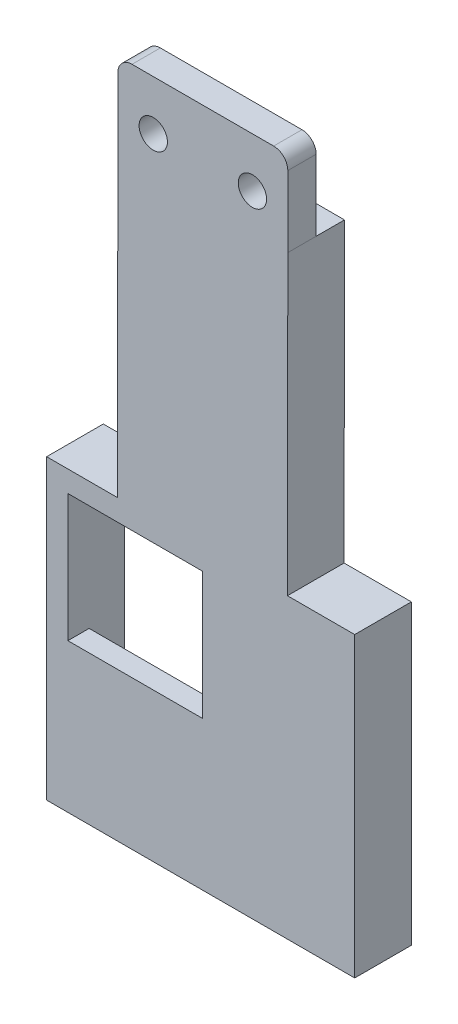
ISO-10303-21;
HEADER;
FILE_DESCRIPTION(('STEP AP214'),'2;1');
FILE_NAME('part.step','',(''),(''),'','','');
FILE_SCHEMA(('AUTOMOTIVE_DESIGN { 1 0 10303 214 1 1 1 1 }'));
ENDSEC;
DATA;
#1=APPLICATION_CONTEXT('core data for automotive mechanical design processes');
#2=APPLICATION_PROTOCOL_DEFINITION('international standard','automotive_design',2000,#1);
#3=PRODUCT_CONTEXT('',#1,'mechanical');
#4=PRODUCT('Part','Part','',(#3));
#5=PRODUCT_RELATED_PRODUCT_CATEGORY('part','',(#4));
#6=PRODUCT_DEFINITION_FORMATION('','',#4);
#7=PRODUCT_DEFINITION_CONTEXT('part definition',#1,'design');
#8=PRODUCT_DEFINITION('design','',#6,#7);
#9=PRODUCT_DEFINITION_SHAPE('','',#8);
#10=(LENGTH_UNIT() NAMED_UNIT(*) SI_UNIT(.MILLI.,.METRE.));
#11=(NAMED_UNIT(*) PLANE_ANGLE_UNIT() SI_UNIT($,.RADIAN.));
#12=(NAMED_UNIT(*) SI_UNIT($,.STERADIAN.) SOLID_ANGLE_UNIT());
#13=UNCERTAINTY_MEASURE_WITH_UNIT(LENGTH_MEASURE(1.E-05),#10,'distance_accuracy_value','');
#14=(GEOMETRIC_REPRESENTATION_CONTEXT(3) GLOBAL_UNCERTAINTY_ASSIGNED_CONTEXT((#13)) GLOBAL_UNIT_ASSIGNED_CONTEXT((#10,
#11,#12)) REPRESENTATION_CONTEXT('',''));
#15=CARTESIAN_POINT('',(0.,0.,0.));
#16=DIRECTION('',(0.,0.,1.));
#17=DIRECTION('',(1.,0.,0.));
#18=AXIS2_PLACEMENT_3D('',#15,#16,#17);
#19=CARTESIAN_POINT('',(-0.0848383427768669,-68.968459670805,0.));
#20=DIRECTION('',(0.00123010255695314,0.999999243423563,0.));
#21=DIRECTION('',(-0.999999243423563,0.00123010255695314,0.));
#22=AXIS2_PLACEMENT_3D('',#19,#20,#21);
#23=PLANE('',#22);
#24=DIRECTION('',(0.999999243423563,-0.00123010255695314,0.));
#25=VECTOR('',#24,1.);
#26=CARTESIAN_POINT('',(-0.0848383427768669,-68.968459670805,1.));
#27=LINE('',#26,#25);
#28=CARTESIAN_POINT('',(37.5278711344987,-69.0147271959118,1.));
#29=VERTEX_POINT('',#28);
#30=CARTESIAN_POINT('',(49.5278711344987,-69.0294884377633,1.));
#31=VERTEX_POINT('',#30);
#32=EDGE_CURVE('E248',#29,#31,#27,.T.);
#33=ORIENTED_EDGE('',*,*,#32,.F.);
#34=DIRECTION('',(0.,0.,1.));
#35=VECTOR('',#34,1.);
#36=CARTESIAN_POINT('',(37.5278711344971,-69.0147271959118,0.));
#37=LINE('',#36,#35);
#38=CARTESIAN_POINT('',(37.5278711344971,-69.0147271959118,-4.));
#39=VERTEX_POINT('',#38);
#40=EDGE_CURVE('E49',#39,#29,#37,.T.);
#41=ORIENTED_EDGE('',*,*,#40,.F.);
#42=DIRECTION('',(0.999999243423563,-0.00123010255695314,0.));
#43=VECTOR('',#42,1.);
#44=CARTESIAN_POINT('',(25.5278711344987,-68.9999659540604,-4.));
#45=LINE('',#44,#43);
#46=CARTESIAN_POINT('',(49.5278711344987,-69.0294884377633,-4.));
#47=VERTEX_POINT('',#46);
#48=EDGE_CURVE('E305',#39,#47,#45,.T.);
#49=ORIENTED_EDGE('',*,*,#48,.T.);
#50=DIRECTION('',(0.,0.,1.));
#51=VECTOR('',#50,1.);
#52=CARTESIAN_POINT('',(49.5278711344987,-69.0294884377633,4.));
#53=LINE('',#52,#51);
#54=EDGE_CURVE('E307',#47,#31,#53,.T.);
#55=ORIENTED_EDGE('',*,*,#54,.T.);
#56=EDGE_LOOP('',(#33,#41,#49,#55));
#57=FACE_BOUND('',#56,.T.);
#58=ADVANCED_FACE('F41',(#57),#23,.F.);
#59=CARTESIAN_POINT('',(25.5278711344987,-68.9999659540604,4.));
#60=DIRECTION('',(0.999999243423563,-0.00123010255695312,0.));
#61=DIRECTION('',(0.00123010255695312,0.999999243423564,0.));
#62=AXIS2_PLACEMENT_3D('',#59,#60,#61);
#63=PLANE('',#62);
#64=DIRECTION('',(0.,0.,1.));
#65=VECTOR('',#64,1.);
#66=CARTESIAN_POINT('',(25.5315432871065,-66.0147271959118,4.));
#67=LINE('',#66,#65);
#68=CARTESIAN_POINT('',(25.5315432871065,-66.0147271959118,-4.));
#69=VERTEX_POINT('',#68);
#70=CARTESIAN_POINT('',(25.5315432871065,-66.0147271959118,4.));
#71=VERTEX_POINT('',#70);
#72=EDGE_CURVE('E64',#69,#71,#67,.T.);
#73=ORIENTED_EDGE('',*,*,#72,.T.);
#74=DIRECTION('',(0.00123010255695312,0.999999243423563,0.));
#75=VECTOR('',#74,1.);
#76=CARTESIAN_POINT('',(25.5278711344987,-68.9999659540604,4.));
#77=LINE('',#76,#75);
#78=CARTESIAN_POINT('',(25.5832257495616,-24.,4.));
#79=VERTEX_POINT('',#78);
#80=EDGE_CURVE('E325',#71,#79,#77,.T.);
#81=ORIENTED_EDGE('',*,*,#80,.T.);
#82=DIRECTION('',(0.,0.,-1.));
#83=VECTOR('',#82,1.);
#84=CARTESIAN_POINT('',(25.5832257495616,-24.,4.));
#85=LINE('',#84,#83);
#86=CARTESIAN_POINT('',(25.5832257495616,-24.,0.));
#87=VERTEX_POINT('',#86);
#88=EDGE_CURVE('E374',#79,#87,#85,.T.);
#89=ORIENTED_EDGE('',*,*,#88,.T.);
#90=DIRECTION('',(0.,0.,-1.));
#91=VECTOR('',#90,1.);
#92=CARTESIAN_POINT('',(25.5832257495616,-24.,4.));
#93=LINE('',#92,#91);
#94=CARTESIAN_POINT('',(25.5832257495616,-24.,-4.));
#95=VERTEX_POINT('',#94);
#96=EDGE_CURVE('E304',#87,#95,#93,.T.);
#97=ORIENTED_EDGE('',*,*,#96,.T.);
#98=DIRECTION('',(0.00123010255695312,0.999999243423563,0.));
#99=VECTOR('',#98,1.);
#100=CARTESIAN_POINT('',(25.5278711344987,-68.9999659540604,-4.));
#101=LINE('',#100,#99);
#102=EDGE_CURVE('E323',#69,#95,#101,.T.);
#103=ORIENTED_EDGE('',*,*,#102,.F.);
#104=EDGE_LOOP('',(#73,#81,#89,#97,#103));
#105=FACE_BOUND('',#104,.T.);
#106=ADVANCED_FACE('F424',(#105),#63,.F.);
#107=CARTESIAN_POINT('',(49.5278711344987,-69.0294884377633,4.));
#108=DIRECTION('',(-0.999999243423563,0.00123010255695312,0.));
#109=DIRECTION('',(-0.00123010255695312,-0.999999243423564,0.));
#110=AXIS2_PLACEMENT_3D('',#107,#108,#109);
#111=PLANE('',#110);
#112=DIRECTION('',(0.00123010255695312,0.999999243423564,0.));
#113=VECTOR('',#112,1.);
#114=CARTESIAN_POINT('',(49.5278711344987,-69.0294884377633,1.));
#115=LINE('',#114,#113);
#116=CARTESIAN_POINT('',(49.5278892923538,-69.0147271959118,1.));
#117=VERTEX_POINT('',#116);
#118=EDGE_CURVE('E246',#31,#117,#115,.T.);
#119=ORIENTED_EDGE('',*,*,#118,.F.);
#120=ORIENTED_EDGE('',*,*,#54,.F.);
#121=DIRECTION('',(0.00123010255695312,0.999999243423563,0.));
#122=VECTOR('',#121,1.);
#123=CARTESIAN_POINT('',(49.5278711344987,-69.0294884377633,-4.));
#124=LINE('',#123,#122);
#125=CARTESIAN_POINT('',(49.5278892923538,-69.0147271959118,-4.));
#126=VERTEX_POINT('',#125);
#127=EDGE_CURVE('E321',#47,#126,#124,.T.);
#128=ORIENTED_EDGE('',*,*,#127,.T.);
#129=DIRECTION('',(0.,0.,-1.));
#130=VECTOR('',#129,1.);
#131=CARTESIAN_POINT('',(49.5278892923538,-69.0147271959118,4.));
#132=LINE('',#131,#130);
#133=EDGE_CURVE('E295',#117,#126,#132,.T.);
#134=ORIENTED_EDGE('',*,*,#133,.F.);
#135=EDGE_LOOP('',(#119,#120,#128,#134));
#136=FACE_BOUND('',#135,.T.);
#137=ADVANCED_FACE('F394',(#136),#111,.F.);
#138=DIRECTION('',(0.00123010255695312,0.999999243423563,0.));
#139=VECTOR('',#138,1.);
#140=CARTESIAN_POINT('',(49.5278711344987,-69.0294884377633,4.));
#141=LINE('',#140,#139);
#142=CARTESIAN_POINT('',(49.5315796028167,-66.0147271959118,4.));
#143=VERTEX_POINT('',#142);
#144=CARTESIAN_POINT('',(49.5832257495616,-24.0295224837029,4.));
#145=VERTEX_POINT('',#144);
#146=EDGE_CURVE('E311',#143,#145,#141,.T.);
#147=ORIENTED_EDGE('',*,*,#146,.F.);
#148=DIRECTION('',(0.,0.,-1.));
#149=VECTOR('',#148,1.);
#150=CARTESIAN_POINT('',(49.5315796028167,-66.0147271959118,4.));
#151=LINE('',#150,#149);
#152=CARTESIAN_POINT('',(49.5315796028167,-66.0147271959118,-4.));
#153=VERTEX_POINT('',#152);
#154=EDGE_CURVE('E11',#143,#153,#151,.T.);
#155=ORIENTED_EDGE('',*,*,#154,.T.);
#156=CARTESIAN_POINT('',(49.5832257495616,-24.0295224837029,-4.));
#157=VERTEX_POINT('',#156);
#158=EDGE_CURVE('E320',#153,#157,#124,.T.);
#159=ORIENTED_EDGE('',*,*,#158,.T.);
#160=DIRECTION('',(0.,0.,1.));
#161=VECTOR('',#160,1.);
#162=CARTESIAN_POINT('',(49.5832257495616,-24.0295224837029,4.));
#163=LINE('',#162,#161);
#164=CARTESIAN_POINT('',(49.5832257495616,-24.0295224837029,0.));
#165=VERTEX_POINT('',#164);
#166=EDGE_CURVE('E308',#157,#165,#163,.T.);
#167=ORIENTED_EDGE('',*,*,#166,.T.);
#168=DIRECTION('',(0.,0.,-1.));
#169=VECTOR('',#168,1.);
#170=CARTESIAN_POINT('',(49.5832257495616,-24.0295224837029,4.));
#171=LINE('',#170,#169);
#172=EDGE_CURVE('E349',#145,#165,#171,.T.);
#173=ORIENTED_EDGE('',*,*,#172,.F.);
#174=EDGE_LOOP('',(#147,#155,#159,#167,#173));
#175=FACE_BOUND('',#174,.T.);
#176=ADVANCED_FACE('F439',(#175),#111,.F.);
#177=CARTESIAN_POINT('',(49.5832257495616,0.,4.));
#178=DIRECTION('',(1.,0.,0.));
#179=DIRECTION('',(0.,0.,-1.));
#180=AXIS2_PLACEMENT_3D('',#177,#178,#179);
#181=PLANE('',#180);
#182=DIRECTION('',(0.,-1.,0.));
#183=VECTOR('',#182,1.);
#184=CARTESIAN_POINT('',(49.5832257495616,0.,0.));
#185=LINE('',#184,#183);
#186=CARTESIAN_POINT('',(49.5832257495616,-14.,0.));
#187=VERTEX_POINT('',#186);
#188=EDGE_CURVE('E355',#187,#165,#185,.T.);
#189=ORIENTED_EDGE('',*,*,#188,.F.);
#190=DIRECTION('',(0.,0.,-1.));
#191=VECTOR('',#190,1.);
#192=CARTESIAN_POINT('',(49.5832257495616,-14.,4.));
#193=LINE('',#192,#191);
#194=CARTESIAN_POINT('',(49.5832257495616,-14.,4.));
#195=VERTEX_POINT('',#194);
#196=EDGE_CURVE('E382',#195,#187,#193,.T.);
#197=ORIENTED_EDGE('',*,*,#196,.F.);
#198=DIRECTION('',(0.,-1.,0.));
#199=VECTOR('',#198,1.);
#200=CARTESIAN_POINT('',(49.5832257495616,0.,4.));
#201=LINE('',#200,#199);
#202=EDGE_CURVE('E335',#195,#145,#201,.T.);
#203=ORIENTED_EDGE('',*,*,#202,.T.);
#204=ORIENTED_EDGE('',*,*,#172,.T.);
#205=EDGE_LOOP('',(#189,#197,#203,#204));
#206=FACE_BOUND('',#205,.T.);
#207=ADVANCED_FACE('F464',(#206),#181,.T.);
#208=CARTESIAN_POINT('',(47.5832257495616,-14.,4.));
#209=DIRECTION('',(0.,0.,-1.));
#210=DIRECTION('',(-1.,0.,0.));
#211=AXIS2_PLACEMENT_3D('',#208,#209,#210);
#212=CYLINDRICAL_SURFACE('',#211,2.);
#213=CARTESIAN_POINT('',(47.5832257495616,-14.,0.));
#214=DIRECTION('',(0.,0.,1.));
#215=DIRECTION('',(1.,0.,0.));
#216=AXIS2_PLACEMENT_3D('',#213,#214,#215);
#217=CIRCLE('',#216,2.);
#218=CARTESIAN_POINT('',(47.5832257495616,-12.,0.));
#219=VERTEX_POINT('',#218);
#220=EDGE_CURVE('E358',#187,#219,#217,.T.);
#221=ORIENTED_EDGE('',*,*,#220,.T.);
#222=DIRECTION('',(0.,0.,-1.));
#223=VECTOR('',#222,1.);
#224=CARTESIAN_POINT('',(47.5832257495616,-12.,4.));
#225=LINE('',#224,#223);
#226=CARTESIAN_POINT('',(47.5832257495616,-12.,4.));
#227=VERTEX_POINT('',#226);
#228=EDGE_CURVE('E380',#227,#219,#225,.T.);
#229=ORIENTED_EDGE('',*,*,#228,.F.);
#230=CARTESIAN_POINT('',(47.5832257495616,-14.,4.));
#231=DIRECTION('',(0.,0.,1.));
#232=DIRECTION('',(1.,0.,0.));
#233=AXIS2_PLACEMENT_3D('',#230,#231,#232);
#234=CIRCLE('',#233,2.);
#235=EDGE_CURVE('E338',#195,#227,#234,.T.);
#236=ORIENTED_EDGE('',*,*,#235,.F.);
#237=ORIENTED_EDGE('',*,*,#196,.T.);
#238=EDGE_LOOP('',(#221,#229,#236,#237));
#239=FACE_BOUND('',#238,.T.);
#240=ADVANCED_FACE('F460',(#239),#212,.T.);
#241=CARTESIAN_POINT('',(0.,-12.,4.));
#242=DIRECTION('',(0.,1.,0.));
#243=DIRECTION('',(0.,0.,1.));
#244=AXIS2_PLACEMENT_3D('',#241,#242,#243);
#245=PLANE('',#244);
#246=DIRECTION('',(1.,0.,0.));
#247=VECTOR('',#246,1.);
#248=CARTESIAN_POINT('',(0.,-12.,0.));
#249=LINE('',#248,#247);
#250=CARTESIAN_POINT('',(27.5832257495616,-12.,0.));
#251=VERTEX_POINT('',#250);
#252=EDGE_CURVE('E361',#251,#219,#249,.T.);
#253=ORIENTED_EDGE('',*,*,#252,.F.);
#254=DIRECTION('',(0.,0.,-1.));
#255=VECTOR('',#254,1.);
#256=CARTESIAN_POINT('',(27.5832257495616,-12.,4.));
#257=LINE('',#256,#255);
#258=CARTESIAN_POINT('',(27.5832257495616,-12.,4.));
#259=VERTEX_POINT('',#258);
#260=EDGE_CURVE('E378',#259,#251,#257,.T.);
#261=ORIENTED_EDGE('',*,*,#260,.F.);
#262=DIRECTION('',(1.,0.,0.));
#263=VECTOR('',#262,1.);
#264=CARTESIAN_POINT('',(0.,-12.,4.));
#265=LINE('',#264,#263);
#266=EDGE_CURVE('E340',#259,#227,#265,.T.);
#267=ORIENTED_EDGE('',*,*,#266,.T.);
#268=ORIENTED_EDGE('',*,*,#228,.T.);
#269=EDGE_LOOP('',(#253,#261,#267,#268));
#270=FACE_BOUND('',#269,.T.);
#271=ADVANCED_FACE('F456',(#270),#245,.T.);
#272=CARTESIAN_POINT('',(27.5832257495616,-14.,4.));
#273=DIRECTION('',(0.,0.,-1.));
#274=DIRECTION('',(-1.,0.,0.));
#275=AXIS2_PLACEMENT_3D('',#272,#273,#274);
#276=CYLINDRICAL_SURFACE('',#275,2.);
#277=CARTESIAN_POINT('',(27.5832257495616,-14.,0.));
#278=DIRECTION('',(0.,0.,1.));
#279=DIRECTION('',(1.,0.,0.));
#280=AXIS2_PLACEMENT_3D('',#277,#278,#279);
#281=CIRCLE('',#280,2.);
#282=CARTESIAN_POINT('',(25.5832257495616,-14.,0.));
#283=VERTEX_POINT('',#282);
#284=EDGE_CURVE('E364',#283,#251,#281,.F.);
#285=ORIENTED_EDGE('',*,*,#284,.F.);
#286=DIRECTION('',(0.,0.,-1.));
#287=VECTOR('',#286,1.);
#288=CARTESIAN_POINT('',(25.5832257495616,-14.,4.));
#289=LINE('',#288,#287);
#290=CARTESIAN_POINT('',(25.5832257495616,-14.,4.));
#291=VERTEX_POINT('',#290);
#292=EDGE_CURVE('E376',#291,#283,#289,.T.);
#293=ORIENTED_EDGE('',*,*,#292,.F.);
#294=CARTESIAN_POINT('',(27.5832257495616,-14.,4.));
#295=DIRECTION('',(0.,0.,1.));
#296=DIRECTION('',(1.,0.,0.));
#297=AXIS2_PLACEMENT_3D('',#294,#295,#296);
#298=CIRCLE('',#297,2.);
#299=EDGE_CURVE('E343',#291,#259,#298,.F.);
#300=ORIENTED_EDGE('',*,*,#299,.T.);
#301=ORIENTED_EDGE('',*,*,#260,.T.);
#302=EDGE_LOOP('',(#285,#293,#300,#301));
#303=FACE_BOUND('',#302,.T.);
#304=ADVANCED_FACE('F452',(#303),#276,.T.);
#305=CARTESIAN_POINT('',(25.5832257495616,0.,4.));
#306=DIRECTION('',(-1.,0.,0.));
#307=DIRECTION('',(0.,0.,1.));
#308=AXIS2_PLACEMENT_3D('',#305,#306,#307);
#309=PLANE('',#308);
#310=DIRECTION('',(0.,1.,0.));
#311=VECTOR('',#310,1.);
#312=CARTESIAN_POINT('',(25.5832257495616,0.,0.));
#313=LINE('',#312,#311);
#314=EDGE_CURVE('E367',#87,#283,#313,.T.);
#315=ORIENTED_EDGE('',*,*,#314,.F.);
#316=ORIENTED_EDGE('',*,*,#88,.F.);
#317=DIRECTION('',(0.,1.,0.));
#318=VECTOR('',#317,1.);
#319=CARTESIAN_POINT('',(25.5832257495616,0.,4.));
#320=LINE('',#319,#318);
#321=EDGE_CURVE('E346',#79,#291,#320,.T.);
#322=ORIENTED_EDGE('',*,*,#321,.T.);
#323=ORIENTED_EDGE('',*,*,#292,.T.);
#324=EDGE_LOOP('',(#315,#316,#322,#323));
#325=FACE_BOUND('',#324,.T.);
#326=ADVANCED_FACE('F448',(#325),#309,.T.);
#327=CARTESIAN_POINT('',(30.5832257495617,-19.,4.));
#328=DIRECTION('',(0.,0.,-1.));
#329=DIRECTION('',(-1.,0.,0.));
#330=AXIS2_PLACEMENT_3D('',#327,#328,#329);
#331=CYLINDRICAL_SURFACE('',#330,1.99999999999994);
#332=CARTESIAN_POINT('',(30.5832257495617,-19.,4.));
#333=DIRECTION('',(0.,0.,1.));
#334=DIRECTION('',(1.,0.,0.));
#335=AXIS2_PLACEMENT_3D('',#332,#333,#334);
#336=CIRCLE('',#335,1.99999999999994);
#337=CARTESIAN_POINT('',(32.5832257495616,-19.,4.));
#338=VERTEX_POINT('',#337);
#339=EDGE_CURVE('E331',#338,#338,#336,.T.);
#340=ORIENTED_EDGE('',*,*,#339,.T.);
#341=EDGE_LOOP('',(#340));
#342=FACE_BOUND('',#341,.T.);
#343=CARTESIAN_POINT('',(30.5832257495617,-19.,0.));
#344=DIRECTION('',(0.,0.,1.));
#345=DIRECTION('',(1.,0.,0.));
#346=AXIS2_PLACEMENT_3D('',#343,#344,#345);
#347=CIRCLE('',#346,1.99999999999994);
#348=CARTESIAN_POINT('',(32.5832257495616,-19.,0.));
#349=VERTEX_POINT('',#348);
#350=EDGE_CURVE('E352',#349,#349,#347,.T.);
#351=ORIENTED_EDGE('',*,*,#350,.F.);
#352=EDGE_LOOP('',(#351));
#353=FACE_BOUND('',#352,.T.);
#354=ADVANCED_FACE('F451',(#342,#353),#331,.F.);
#355=CARTESIAN_POINT('',(44.5832257495617,-19.,4.));
#356=DIRECTION('',(0.,0.,-1.));
#357=DIRECTION('',(-1.,0.,0.));
#358=AXIS2_PLACEMENT_3D('',#355,#356,#357);
#359=CYLINDRICAL_SURFACE('',#358,1.99999999999995);
#360=CARTESIAN_POINT('',(44.5832257495617,-19.,4.));
#361=DIRECTION('',(0.,0.,1.));
#362=DIRECTION('',(1.,0.,0.));
#363=AXIS2_PLACEMENT_3D('',#360,#361,#362);
#364=CIRCLE('',#363,1.99999999999995);
#365=CARTESIAN_POINT('',(46.5832257495616,-19.,4.));
#366=VERTEX_POINT('',#365);
#367=EDGE_CURVE('E328',#366,#366,#364,.T.);
#368=ORIENTED_EDGE('',*,*,#367,.T.);
#369=EDGE_LOOP('',(#368));
#370=FACE_BOUND('',#369,.T.);
#371=CARTESIAN_POINT('',(44.5832257495617,-19.,0.));
#372=DIRECTION('',(0.,0.,1.));
#373=DIRECTION('',(1.,0.,0.));
#374=AXIS2_PLACEMENT_3D('',#371,#372,#373);
#375=CIRCLE('',#374,1.99999999999995);
#376=CARTESIAN_POINT('',(46.5832257495616,-19.,0.));
#377=VERTEX_POINT('',#376);
#378=EDGE_CURVE('E327',#377,#377,#375,.T.);
#379=ORIENTED_EDGE('',*,*,#378,.F.);
#380=EDGE_LOOP('',(#379));
#381=FACE_BOUND('',#380,.T.);
#382=ADVANCED_FACE('F43',(#370,#381),#359,.F.);
#383=CARTESIAN_POINT('',(0.,0.,4.));
#384=DIRECTION('',(0.,0.,1.));
#385=DIRECTION('',(1.,0.,0.));
#386=AXIS2_PLACEMENT_3D('',#383,#384,#385);
#387=PLANE('',#386);
#388=DIRECTION('',(-1.,0.,0.));
#389=VECTOR('',#388,1.);
#390=CARTESIAN_POINT('',(18.5278711344987,-69.0147271959118,4.));
#391=LINE('',#390,#389);
#392=CARTESIAN_POINT('',(37.5278711344987,-69.0147271959118,4.));
#393=VERTEX_POINT('',#392);
#394=CARTESIAN_POINT('',(18.5278711344987,-69.0147271959118,4.));
#395=VERTEX_POINT('',#394);
#396=EDGE_CURVE('E207',#393,#395,#391,.T.);
#397=ORIENTED_EDGE('',*,*,#396,.F.);
#398=DIRECTION('',(0.,1.,0.));
#399=VECTOR('',#398,1.);
#400=CARTESIAN_POINT('',(37.5278711344987,-69.0147271959118,4.));
#401=LINE('',#400,#399);
#402=CARTESIAN_POINT('',(37.5278711344987,-87.0147271959118,4.));
#403=VERTEX_POINT('',#402);
#404=EDGE_CURVE('E56',#403,#393,#401,.T.);
#405=ORIENTED_EDGE('',*,*,#404,.F.);
#406=DIRECTION('',(1.,0.,0.));
#407=VECTOR('',#406,1.);
#408=CARTESIAN_POINT('',(37.5278711344987,-87.0147271959118,4.));
#409=LINE('',#408,#407);
#410=CARTESIAN_POINT('',(18.5278711344987,-87.0147271959118,4.));
#411=VERTEX_POINT('',#410);
#412=EDGE_CURVE('E218',#411,#403,#409,.T.);
#413=ORIENTED_EDGE('',*,*,#412,.F.);
#414=DIRECTION('',(0.,-1.,0.));
#415=VECTOR('',#414,1.);
#416=CARTESIAN_POINT('',(18.5278711344987,-87.0147271959118,4.));
#417=LINE('',#416,#415);
#418=EDGE_CURVE('E197',#395,#411,#417,.T.);
#419=ORIENTED_EDGE('',*,*,#418,.F.);
#420=EDGE_LOOP('',(#397,#405,#413,#419));
#421=FACE_BOUND('',#420,.T.);
#422=DIRECTION('',(-1.,0.,0.));
#423=VECTOR('',#422,1.);
#424=CARTESIAN_POINT('',(59.0278711344987,-66.0147271959118,4.));
#425=LINE('',#424,#423);
#426=CARTESIAN_POINT('',(59.0278711344987,-66.0147271959118,4.));
#427=VERTEX_POINT('',#426);
#428=EDGE_CURVE('E234',#427,#143,#425,.T.);
#429=ORIENTED_EDGE('',*,*,#428,.T.);
#430=ORIENTED_EDGE('',*,*,#146,.T.);
#431=ORIENTED_EDGE('',*,*,#202,.F.);
#432=ORIENTED_EDGE('',*,*,#235,.T.);
#433=ORIENTED_EDGE('',*,*,#266,.F.);
#434=ORIENTED_EDGE('',*,*,#299,.F.);
#435=ORIENTED_EDGE('',*,*,#321,.F.);
#436=ORIENTED_EDGE('',*,*,#80,.F.);
#437=CARTESIAN_POINT('',(15.5278711344987,-66.0147271959118,4.));
#438=VERTEX_POINT('',#437);
#439=EDGE_CURVE('E233',#71,#438,#425,.T.);
#440=ORIENTED_EDGE('',*,*,#439,.T.);
#441=DIRECTION('',(0.,-1.,0.));
#442=VECTOR('',#441,1.);
#443=CARTESIAN_POINT('',(15.5278711344987,-66.0147271959118,4.));
#444=LINE('',#443,#442);
#445=CARTESIAN_POINT('',(15.5278711344987,-108.014727195912,4.));
#446=VERTEX_POINT('',#445);
#447=EDGE_CURVE('E237',#438,#446,#444,.T.);
#448=ORIENTED_EDGE('',*,*,#447,.T.);
#449=DIRECTION('',(1.,0.,0.));
#450=VECTOR('',#449,1.);
#451=CARTESIAN_POINT('',(15.5278711344987,-108.014727195912,4.));
#452=LINE('',#451,#450);
#453=CARTESIAN_POINT('',(59.0278711344987,-108.014727195912,4.));
#454=VERTEX_POINT('',#453);
#455=EDGE_CURVE('E240',#446,#454,#452,.T.);
#456=ORIENTED_EDGE('',*,*,#455,.T.);
#457=DIRECTION('',(0.,1.,0.));
#458=VECTOR('',#457,1.);
#459=CARTESIAN_POINT('',(59.0278711344987,-108.014727195912,4.));
#460=LINE('',#459,#458);
#461=EDGE_CURVE('E243',#454,#427,#460,.T.);
#462=ORIENTED_EDGE('',*,*,#461,.T.);
#463=EDGE_LOOP('',(#429,#430,#431,#432,#433,#434,#435,#436,#440,#448,#456,#462));
#464=FACE_BOUND('',#463,.T.);
#465=ORIENTED_EDGE('',*,*,#367,.F.);
#466=EDGE_LOOP('',(#465));
#467=FACE_BOUND('',#466,.T.);
#468=ORIENTED_EDGE('',*,*,#339,.F.);
#469=EDGE_LOOP('',(#468));
#470=FACE_BOUND('',#469,.T.);
#471=ADVANCED_FACE('F215',(#421,#464,#467,#470),#387,.T.);
#472=CARTESIAN_POINT('',(0.,0.,0.));
#473=DIRECTION('',(0.,0.,1.));
#474=DIRECTION('',(1.,0.,0.));
#475=AXIS2_PLACEMENT_3D('',#472,#473,#474);
#476=PLANE('',#475);
#477=ORIENTED_EDGE('',*,*,#378,.T.);
#478=EDGE_LOOP('',(#477));
#479=FACE_BOUND('',#478,.T.);
#480=ORIENTED_EDGE('',*,*,#350,.T.);
#481=EDGE_LOOP('',(#480));
#482=FACE_BOUND('',#481,.T.);
#483=ORIENTED_EDGE('',*,*,#188,.T.);
#484=DIRECTION('',(-0.999999243423564,0.00123010255695312,0.));
#485=VECTOR('',#484,1.);
#486=CARTESIAN_POINT('',(-0.0294837277139761,-23.9684937167446,0.));
#487=LINE('',#486,#485);
#488=EDGE_CURVE('E332',#165,#87,#487,.T.);
#489=ORIENTED_EDGE('',*,*,#488,.T.);
#490=ORIENTED_EDGE('',*,*,#314,.T.);
#491=ORIENTED_EDGE('',*,*,#284,.T.);
#492=ORIENTED_EDGE('',*,*,#252,.T.);
#493=ORIENTED_EDGE('',*,*,#220,.F.);
#494=EDGE_LOOP('',(#483,#489,#490,#491,#492,#493));
#495=FACE_BOUND('',#494,.T.);
#496=ADVANCED_FACE('F435',(#479,#482,#495),#476,.F.);
#497=CARTESIAN_POINT('',(-0.0294837277139764,-23.9684937167446,0.));
#498=DIRECTION('',(0.00123010255695314,0.999999243423563,0.));
#499=DIRECTION('',(-0.999999243423563,0.00123010255695314,0.));
#500=AXIS2_PLACEMENT_3D('',#497,#498,#499);
#501=PLANE('',#500);
#502=ORIENTED_EDGE('',*,*,#488,.F.);
#503=ORIENTED_EDGE('',*,*,#166,.F.);
#504=DIRECTION('',(0.999999243423563,-0.00123010255695314,0.));
#505=VECTOR('',#504,1.);
#506=CARTESIAN_POINT('',(25.5832257495616,-24.,-4.));
#507=LINE('',#506,#505);
#508=EDGE_CURVE('E314',#95,#157,#507,.T.);
#509=ORIENTED_EDGE('',*,*,#508,.F.);
#510=ORIENTED_EDGE('',*,*,#96,.F.);
#511=EDGE_LOOP('',(#502,#503,#509,#510));
#512=FACE_BOUND('',#511,.T.);
#513=ADVANCED_FACE('F432',(#512),#501,.T.);
#514=CARTESIAN_POINT('',(25.5278711344987,-68.9999659540604,-4.));
#515=DIRECTION('',(0.,0.,1.));
#516=DIRECTION('',(1.,0.,0.));
#517=AXIS2_PLACEMENT_3D('',#514,#515,#516);
#518=PLANE('',#517);
#519=DIRECTION('',(-1.,0.,0.));
#520=VECTOR('',#519,1.);
#521=CARTESIAN_POINT('',(37.5278711344987,-66.0147271959118,-4.));
#522=LINE('',#521,#520);
#523=CARTESIAN_POINT('',(15.5278711344987,-66.0147271959118,-4.));
#524=VERTEX_POINT('',#523);
#525=EDGE_CURVE('E275',#69,#524,#522,.T.);
#526=ORIENTED_EDGE('',*,*,#525,.F.);
#527=ORIENTED_EDGE('',*,*,#102,.T.);
#528=ORIENTED_EDGE('',*,*,#508,.T.);
#529=ORIENTED_EDGE('',*,*,#158,.F.);
#530=CARTESIAN_POINT('',(59.0278711344987,-66.0147271959118,-4.));
#531=VERTEX_POINT('',#530);
#532=EDGE_CURVE('E281',#531,#153,#522,.T.);
#533=ORIENTED_EDGE('',*,*,#532,.F.);
#534=DIRECTION('',(0.,1.,0.));
#535=VECTOR('',#534,1.);
#536=CARTESIAN_POINT('',(59.0278711344987,-66.0147271959118,-4.));
#537=LINE('',#536,#535);
#538=CARTESIAN_POINT('',(59.0278711344987,-108.014727195912,-4.));
#539=VERTEX_POINT('',#538);
#540=EDGE_CURVE('E289',#539,#531,#537,.T.);
#541=ORIENTED_EDGE('',*,*,#540,.F.);
#542=DIRECTION('',(1.,0.,0.));
#543=VECTOR('',#542,1.);
#544=CARTESIAN_POINT('',(15.5278711344987,-108.014727195912,-4.));
#545=LINE('',#544,#543);
#546=CARTESIAN_POINT('',(15.5278711344987,-108.014727195912,-4.));
#547=VERTEX_POINT('',#546);
#548=EDGE_CURVE('E287',#547,#539,#545,.T.);
#549=ORIENTED_EDGE('',*,*,#548,.F.);
#550=DIRECTION('',(0.,-1.,0.));
#551=VECTOR('',#550,1.);
#552=CARTESIAN_POINT('',(15.5278711344987,-66.0147271959118,-4.));
#553=LINE('',#552,#551);
#554=EDGE_CURVE('E284',#524,#547,#553,.T.);
#555=ORIENTED_EDGE('',*,*,#554,.F.);
#556=EDGE_LOOP('',(#526,#527,#528,#529,#533,#541,#549,#555));
#557=FACE_BOUND('',#556,.T.);
#558=ORIENTED_EDGE('',*,*,#48,.F.);
#559=DIRECTION('',(-1.,0.,0.));
#560=VECTOR('',#559,1.);
#561=CARTESIAN_POINT('',(37.5278711344987,-69.0147271959118,-4.));
#562=LINE('',#561,#560);
#563=CARTESIAN_POINT('',(18.5278711344987,-69.0147271959118,-4.));
#564=VERTEX_POINT('',#563);
#565=EDGE_CURVE('E254',#39,#564,#562,.T.);
#566=ORIENTED_EDGE('',*,*,#565,.T.);
#567=DIRECTION('',(0.,-1.,0.));
#568=VECTOR('',#567,1.);
#569=CARTESIAN_POINT('',(18.5278711344987,-69.0147271959118,-4.));
#570=LINE('',#569,#568);
#571=CARTESIAN_POINT('',(18.5278711344987,-105.014727195912,-4.));
#572=VERTEX_POINT('',#571);
#573=EDGE_CURVE('E200',#564,#572,#570,.T.);
#574=ORIENTED_EDGE('',*,*,#573,.T.);
#575=DIRECTION('',(1.,0.,0.));
#576=VECTOR('',#575,1.);
#577=CARTESIAN_POINT('',(18.5278711344987,-105.014727195912,-4.));
#578=LINE('',#577,#576);
#579=CARTESIAN_POINT('',(56.0278711344987,-105.014727195912,-4.));
#580=VERTEX_POINT('',#579);
#581=EDGE_CURVE('E256',#572,#580,#578,.T.);
#582=ORIENTED_EDGE('',*,*,#581,.T.);
#583=DIRECTION('',(0.,1.,0.));
#584=VECTOR('',#583,1.);
#585=CARTESIAN_POINT('',(56.0278711344987,-69.0147271959118,-4.));
#586=LINE('',#585,#584);
#587=CARTESIAN_POINT('',(56.0278711344987,-69.0147271959118,-4.));
#588=VERTEX_POINT('',#587);
#589=EDGE_CURVE('E204',#580,#588,#586,.T.);
#590=ORIENTED_EDGE('',*,*,#589,.T.);
#591=EDGE_CURVE('E251',#588,#126,#562,.T.);
#592=ORIENTED_EDGE('',*,*,#591,.T.);
#593=ORIENTED_EDGE('',*,*,#127,.F.);
#594=EDGE_LOOP('',(#558,#566,#574,#582,#590,#592,#593));
#595=FACE_BOUND('',#594,.T.);
#596=ADVANCED_FACE('F388',(#557,#595),#518,.F.);
#597=CARTESIAN_POINT('',(37.5278711344987,-66.0147271959118,-4.));
#598=DIRECTION('',(0.,1.,0.));
#599=DIRECTION('',(0.,0.,1.));
#600=AXIS2_PLACEMENT_3D('',#597,#598,#599);
#601=PLANE('',#600);
#602=ORIENTED_EDGE('',*,*,#72,.F.);
#603=ORIENTED_EDGE('',*,*,#525,.T.);
#604=DIRECTION('',(0.,0.,1.));
#605=VECTOR('',#604,1.);
#606=CARTESIAN_POINT('',(15.5278711344987,-66.0147271959118,-4.));
#607=LINE('',#606,#605);
#608=EDGE_CURVE('E292',#524,#438,#607,.T.);
#609=ORIENTED_EDGE('',*,*,#608,.T.);
#610=ORIENTED_EDGE('',*,*,#439,.F.);
#611=EDGE_LOOP('',(#602,#603,#609,#610));
#612=FACE_BOUND('',#611,.T.);
#613=ADVANCED_FACE('F418',(#612),#601,.T.);
#614=ORIENTED_EDGE('',*,*,#154,.F.);
#615=ORIENTED_EDGE('',*,*,#428,.F.);
#616=DIRECTION('',(0.,0.,1.));
#617=VECTOR('',#616,1.);
#618=CARTESIAN_POINT('',(59.0278711344987,-66.0147271959118,-4.));
#619=LINE('',#618,#617);
#620=EDGE_CURVE('E293',#531,#427,#619,.T.);
#621=ORIENTED_EDGE('',*,*,#620,.F.);
#622=ORIENTED_EDGE('',*,*,#532,.T.);
#623=EDGE_LOOP('',(#614,#615,#621,#622));
#624=FACE_BOUND('',#623,.T.);
#625=ADVANCED_FACE('F411',(#624),#601,.T.);
#626=CARTESIAN_POINT('',(37.5278711344987,-69.0147271959118,-4.));
#627=DIRECTION('',(0.,1.,0.));
#628=DIRECTION('',(0.,0.,1.));
#629=AXIS2_PLACEMENT_3D('',#626,#627,#628);
#630=PLANE('',#629);
#631=DIRECTION('',(-1.,0.,0.));
#632=VECTOR('',#631,1.);
#633=CARTESIAN_POINT('',(37.5278711344987,-69.0147271959118,1.));
#634=LINE('',#633,#632);
#635=CARTESIAN_POINT('',(56.0278711344987,-69.0147271959118,1.));
#636=VERTEX_POINT('',#635);
#637=EDGE_CURVE('E250',#636,#117,#634,.T.);
#638=ORIENTED_EDGE('',*,*,#637,.T.);
#639=ORIENTED_EDGE('',*,*,#133,.T.);
#640=ORIENTED_EDGE('',*,*,#591,.F.);
#641=DIRECTION('',(0.,0.,1.));
#642=VECTOR('',#641,1.);
#643=CARTESIAN_POINT('',(56.0278711344987,-69.0147271959118,-4.));
#644=LINE('',#643,#642);
#645=EDGE_CURVE('E272',#588,#636,#644,.T.);
#646=ORIENTED_EDGE('',*,*,#645,.T.);
#647=EDGE_LOOP('',(#638,#639,#640,#646));
#648=FACE_BOUND('',#647,.T.);
#649=ADVANCED_FACE('F409',(#648),#630,.F.);
#650=ORIENTED_EDGE('',*,*,#565,.F.);
#651=ORIENTED_EDGE('',*,*,#40,.T.);
#652=DIRECTION('',(0.,0.,-1.));
#653=VECTOR('',#652,1.);
#654=CARTESIAN_POINT('',(37.5278711344987,-69.0147271959118,4.));
#655=LINE('',#654,#653);
#656=EDGE_CURVE('E210',#393,#29,#655,.T.);
#657=ORIENTED_EDGE('',*,*,#656,.F.);
#658=ORIENTED_EDGE('',*,*,#396,.T.);
#659=DIRECTION('',(0.,0.,1.));
#660=VECTOR('',#659,1.);
#661=CARTESIAN_POINT('',(18.5278711344987,-69.0147271959118,-4.));
#662=LINE('',#661,#660);
#663=EDGE_CURVE('E192',#564,#395,#662,.T.);
#664=ORIENTED_EDGE('',*,*,#663,.F.);
#665=EDGE_LOOP('',(#650,#651,#657,#658,#664));
#666=FACE_BOUND('',#665,.T.);
#667=ADVANCED_FACE('F208',(#666),#630,.F.);
#668=CARTESIAN_POINT('',(59.0278711344987,-66.0147271959118,-4.));
#669=DIRECTION('',(1.,0.,0.));
#670=DIRECTION('',(0.,1.,0.));
#671=AXIS2_PLACEMENT_3D('',#668,#669,#670);
#672=PLANE('',#671);
#673=ORIENTED_EDGE('',*,*,#620,.T.);
#674=ORIENTED_EDGE('',*,*,#461,.F.);
#675=DIRECTION('',(0.,0.,1.));
#676=VECTOR('',#675,1.);
#677=CARTESIAN_POINT('',(59.0278711344987,-108.014727195912,-4.));
#678=LINE('',#677,#676);
#679=EDGE_CURVE('E296',#539,#454,#678,.T.);
#680=ORIENTED_EDGE('',*,*,#679,.F.);
#681=ORIENTED_EDGE('',*,*,#540,.T.);
#682=EDGE_LOOP('',(#673,#674,#680,#681));
#683=FACE_BOUND('',#682,.T.);
#684=ADVANCED_FACE('F417',(#683),#672,.T.);
#685=CARTESIAN_POINT('',(59.0278711344987,-108.014727195912,-4.));
#686=DIRECTION('',(0.,-1.,0.));
#687=DIRECTION('',(0.,0.,-1.));
#688=AXIS2_PLACEMENT_3D('',#685,#686,#687);
#689=PLANE('',#688);
#690=ORIENTED_EDGE('',*,*,#679,.T.);
#691=ORIENTED_EDGE('',*,*,#455,.F.);
#692=DIRECTION('',(0.,0.,1.));
#693=VECTOR('',#692,1.);
#694=CARTESIAN_POINT('',(15.5278711344987,-108.014727195912,-4.));
#695=LINE('',#694,#693);
#696=EDGE_CURVE('E298',#547,#446,#695,.T.);
#697=ORIENTED_EDGE('',*,*,#696,.F.);
#698=ORIENTED_EDGE('',*,*,#548,.T.);
#699=EDGE_LOOP('',(#690,#691,#697,#698));
#700=FACE_BOUND('',#699,.T.);
#701=ADVANCED_FACE('F515',(#700),#689,.T.);
#702=CARTESIAN_POINT('',(15.5278711344987,-66.0147271959118,-4.));
#703=DIRECTION('',(-1.,0.,0.));
#704=DIRECTION('',(0.,-1.,0.));
#705=AXIS2_PLACEMENT_3D('',#702,#703,#704);
#706=PLANE('',#705);
#707=ORIENTED_EDGE('',*,*,#696,.T.);
#708=ORIENTED_EDGE('',*,*,#447,.F.);
#709=ORIENTED_EDGE('',*,*,#608,.F.);
#710=ORIENTED_EDGE('',*,*,#554,.T.);
#711=EDGE_LOOP('',(#707,#708,#709,#710));
#712=FACE_BOUND('',#711,.T.);
#713=ADVANCED_FACE('F512',(#712),#706,.T.);
#714=CARTESIAN_POINT('',(56.0278711344987,-69.0147271959118,-4.));
#715=DIRECTION('',(1.,0.,0.));
#716=DIRECTION('',(0.,1.,0.));
#717=AXIS2_PLACEMENT_3D('',#714,#715,#716);
#718=PLANE('',#717);
#719=DIRECTION('',(0.,1.,0.));
#720=VECTOR('',#719,1.);
#721=CARTESIAN_POINT('',(56.0278711344987,-69.0147271959118,1.));
#722=LINE('',#721,#720);
#723=CARTESIAN_POINT('',(56.0278711344987,-105.014727195912,1.));
#724=VERTEX_POINT('',#723);
#725=EDGE_CURVE('E269',#724,#636,#722,.T.);
#726=ORIENTED_EDGE('',*,*,#725,.T.);
#727=ORIENTED_EDGE('',*,*,#645,.F.);
#728=ORIENTED_EDGE('',*,*,#589,.F.);
#729=DIRECTION('',(0.,0.,1.));
#730=VECTOR('',#729,1.);
#731=CARTESIAN_POINT('',(56.0278711344987,-105.014727195912,-4.));
#732=LINE('',#731,#730);
#733=EDGE_CURVE('E276',#580,#724,#732,.T.);
#734=ORIENTED_EDGE('',*,*,#733,.T.);
#735=EDGE_LOOP('',(#726,#727,#728,#734));
#736=FACE_BOUND('',#735,.T.);
#737=ADVANCED_FACE('F407',(#736),#718,.F.);
#738=CARTESIAN_POINT('',(56.0278711344987,-105.014727195912,-4.));
#739=DIRECTION('',(0.,-1.,0.));
#740=DIRECTION('',(0.,0.,-1.));
#741=AXIS2_PLACEMENT_3D('',#738,#739,#740);
#742=PLANE('',#741);
#743=DIRECTION('',(1.,0.,0.));
#744=VECTOR('',#743,1.);
#745=CARTESIAN_POINT('',(56.0278711344987,-105.014727195912,1.));
#746=LINE('',#745,#744);
#747=CARTESIAN_POINT('',(18.5278711344987,-105.014727195912,1.));
#748=VERTEX_POINT('',#747);
#749=EDGE_CURVE('E266',#748,#724,#746,.T.);
#750=ORIENTED_EDGE('',*,*,#749,.T.);
#751=ORIENTED_EDGE('',*,*,#733,.F.);
#752=ORIENTED_EDGE('',*,*,#581,.F.);
#753=DIRECTION('',(0.,0.,1.));
#754=VECTOR('',#753,1.);
#755=CARTESIAN_POINT('',(18.5278711344987,-105.014727195912,-4.));
#756=LINE('',#755,#754);
#757=EDGE_CURVE('E203',#572,#748,#756,.T.);
#758=ORIENTED_EDGE('',*,*,#757,.T.);
#759=EDGE_LOOP('',(#750,#751,#752,#758));
#760=FACE_BOUND('',#759,.T.);
#761=ADVANCED_FACE('F403',(#760),#742,.F.);
#762=CARTESIAN_POINT('',(18.5278711344987,-69.0147271959118,-4.));
#763=DIRECTION('',(-1.,0.,0.));
#764=DIRECTION('',(0.,-1.,0.));
#765=AXIS2_PLACEMENT_3D('',#762,#763,#764);
#766=PLANE('',#765);
#767=ORIENTED_EDGE('',*,*,#663,.T.);
#768=ORIENTED_EDGE('',*,*,#418,.T.);
#769=DIRECTION('',(0.,0.,-1.));
#770=VECTOR('',#769,1.);
#771=CARTESIAN_POINT('',(18.5278711344987,-87.0147271959118,4.));
#772=LINE('',#771,#770);
#773=CARTESIAN_POINT('',(18.5278711344987,-87.0147271959118,1.));
#774=VERTEX_POINT('',#773);
#775=EDGE_CURVE('E231',#411,#774,#772,.T.);
#776=ORIENTED_EDGE('',*,*,#775,.T.);
#777=DIRECTION('',(0.,-1.,0.));
#778=VECTOR('',#777,1.);
#779=CARTESIAN_POINT('',(18.5278711344987,-69.0147271959118,1.));
#780=LINE('',#779,#778);
#781=EDGE_CURVE('E263',#774,#748,#780,.T.);
#782=ORIENTED_EDGE('',*,*,#781,.T.);
#783=ORIENTED_EDGE('',*,*,#757,.F.);
#784=ORIENTED_EDGE('',*,*,#573,.F.);
#785=EDGE_LOOP('',(#767,#768,#776,#782,#783,#784));
#786=FACE_BOUND('',#785,.T.);
#787=ADVANCED_FACE('F194',(#786),#766,.F.);
#788=CARTESIAN_POINT('',(0.,0.,1.));
#789=DIRECTION('',(0.,0.,1.));
#790=DIRECTION('',(1.,0.,0.));
#791=AXIS2_PLACEMENT_3D('',#788,#789,#790);
#792=PLANE('',#791);
#793=DIRECTION('',(0.,1.,0.));
#794=VECTOR('',#793,1.);
#795=CARTESIAN_POINT('',(37.5278711344987,-69.0147271959118,1.));
#796=LINE('',#795,#794);
#797=CARTESIAN_POINT('',(37.5278711344987,-87.0147271959118,1.));
#798=VERTEX_POINT('',#797);
#799=EDGE_CURVE('E212',#798,#29,#796,.T.);
#800=ORIENTED_EDGE('',*,*,#799,.T.);
#801=ORIENTED_EDGE('',*,*,#32,.T.);
#802=ORIENTED_EDGE('',*,*,#118,.T.);
#803=ORIENTED_EDGE('',*,*,#637,.F.);
#804=ORIENTED_EDGE('',*,*,#725,.F.);
#805=ORIENTED_EDGE('',*,*,#749,.F.);
#806=ORIENTED_EDGE('',*,*,#781,.F.);
#807=DIRECTION('',(1.,0.,0.));
#808=VECTOR('',#807,1.);
#809=CARTESIAN_POINT('',(37.5278711344987,-87.0147271959118,1.));
#810=LINE('',#809,#808);
#811=EDGE_CURVE('E223',#774,#798,#810,.T.);
#812=ORIENTED_EDGE('',*,*,#811,.T.);
#813=EDGE_LOOP('',(#800,#801,#802,#803,#804,#805,#806,#812));
#814=FACE_BOUND('',#813,.T.);
#815=ADVANCED_FACE('F396',(#814),#792,.F.);
#816=CARTESIAN_POINT('',(37.5278711344987,-87.0147271959118,4.));
#817=DIRECTION('',(0.,1.,0.));
#818=DIRECTION('',(0.,0.,1.));
#819=AXIS2_PLACEMENT_3D('',#816,#817,#818);
#820=PLANE('',#819);
#821=ORIENTED_EDGE('',*,*,#811,.F.);
#822=ORIENTED_EDGE('',*,*,#775,.F.);
#823=ORIENTED_EDGE('',*,*,#412,.T.);
#824=DIRECTION('',(0.,0.,-1.));
#825=VECTOR('',#824,1.);
#826=CARTESIAN_POINT('',(37.5278711344987,-87.0147271959118,4.));
#827=LINE('',#826,#825);
#828=EDGE_CURVE('E229',#403,#798,#827,.T.);
#829=ORIENTED_EDGE('',*,*,#828,.T.);
#830=EDGE_LOOP('',(#821,#822,#823,#829));
#831=FACE_BOUND('',#830,.T.);
#832=ADVANCED_FACE('F401',(#831),#820,.T.);
#833=CARTESIAN_POINT('',(37.5278711344987,-69.0147271959118,4.));
#834=DIRECTION('',(-1.,0.,0.));
#835=DIRECTION('',(0.,0.,1.));
#836=AXIS2_PLACEMENT_3D('',#833,#834,#835);
#837=PLANE('',#836);
#838=ORIENTED_EDGE('',*,*,#799,.F.);
#839=ORIENTED_EDGE('',*,*,#828,.F.);
#840=ORIENTED_EDGE('',*,*,#404,.T.);
#841=ORIENTED_EDGE('',*,*,#656,.T.);
#842=EDGE_LOOP('',(#838,#839,#840,#841));
#843=FACE_BOUND('',#842,.T.);
#844=ADVANCED_FACE('F399',(#843),#837,.T.);
#845=CLOSED_SHELL('',(#58,#106,#137,#176,#207,#240,#271,#304,#326,#354,#382,#471,#496,#513,#596,
#613,#625,#649,#667,#684,#701,#713,#737,#761,#787,#815,#832,#844));
#846=MANIFOLD_SOLID_BREP('B2',#845);
#847=ADVANCED_BREP_SHAPE_REPRESENTATION('',(#18,#846),#14);
#848=SHAPE_DEFINITION_REPRESENTATION(#9,#847);
ENDSEC;
END-ISO-10303-21;
